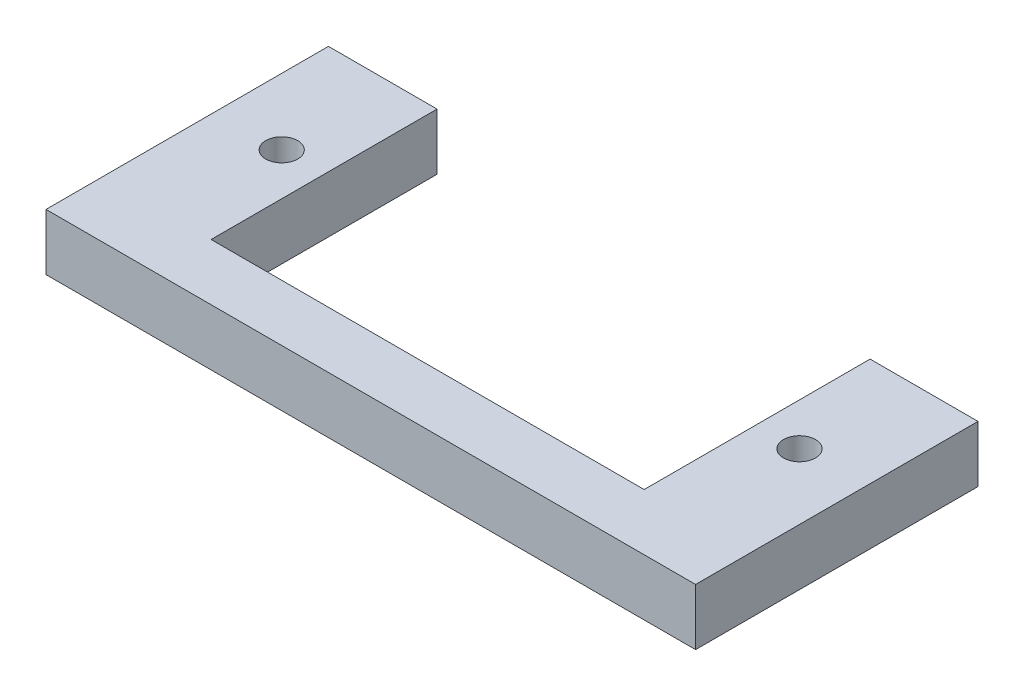
ISO-10303-21;
HEADER;
FILE_DESCRIPTION(('STEP AP214'),'2;1');
FILE_NAME('part.step','',(''),(''),'','','');
FILE_SCHEMA(('AUTOMOTIVE_DESIGN { 1 0 10303 214 1 1 1 1 }'));
ENDSEC;
DATA;
#1=APPLICATION_CONTEXT('core data for automotive mechanical design processes');
#2=APPLICATION_PROTOCOL_DEFINITION('international standard','automotive_design',2000,#1);
#3=PRODUCT_CONTEXT('',#1,'mechanical');
#4=PRODUCT('Part','Part','',(#3));
#5=PRODUCT_RELATED_PRODUCT_CATEGORY('part','',(#4));
#6=PRODUCT_DEFINITION_FORMATION('','',#4);
#7=PRODUCT_DEFINITION_CONTEXT('part definition',#1,'design');
#8=PRODUCT_DEFINITION('design','',#6,#7);
#9=PRODUCT_DEFINITION_SHAPE('','',#8);
#10=(LENGTH_UNIT() NAMED_UNIT(*) SI_UNIT(.MILLI.,.METRE.));
#11=(NAMED_UNIT(*) PLANE_ANGLE_UNIT() SI_UNIT($,.RADIAN.));
#12=(NAMED_UNIT(*) SI_UNIT($,.STERADIAN.) SOLID_ANGLE_UNIT());
#13=UNCERTAINTY_MEASURE_WITH_UNIT(LENGTH_MEASURE(1.E-05),#10,'distance_accuracy_value','');
#14=(GEOMETRIC_REPRESENTATION_CONTEXT(3) GLOBAL_UNCERTAINTY_ASSIGNED_CONTEXT((#13)) GLOBAL_UNIT_ASSIGNED_CONTEXT((#10,
#11,#12)) REPRESENTATION_CONTEXT('',''));
#15=CARTESIAN_POINT('',(0.,0.,0.));
#16=DIRECTION('',(0.,0.,1.));
#17=DIRECTION('',(1.,0.,0.));
#18=AXIS2_PLACEMENT_3D('',#15,#16,#17);
#19=CARTESIAN_POINT('',(0.,3.,0.));
#20=DIRECTION('',(0.,1.,0.));
#21=DIRECTION('',(0.,0.,1.));
#22=AXIS2_PLACEMENT_3D('',#19,#20,#21);
#23=PLANE('',#22);
#24=CARTESIAN_POINT('',(-42.821981333648,3.,-9.));
#25=DIRECTION('',(0.,1.,0.));
#26=DIRECTION('',(0.,0.,1.));
#27=AXIS2_PLACEMENT_3D('',#24,#25,#26);
#28=CIRCLE('',#27,0.85);
#29=CARTESIAN_POINT('',(-42.821981333648,3.,-8.15));
#30=VERTEX_POINT('',#29);
#31=EDGE_CURVE('E142',#30,#30,#28,.T.);
#32=ORIENTED_EDGE('',*,*,#31,.F.);
#33=EDGE_LOOP('',(#32));
#34=FACE_BOUND('',#33,.T.);
#35=DIRECTION('',(-1.,0.,0.));
#36=VECTOR('',#35,1.);
#37=CARTESIAN_POINT('',(-40.571981333648,3.,-15.));
#38=LINE('',#37,#36);
#39=CARTESIAN_POINT('',(-40.571981333648,3.,-15.));
#40=VERTEX_POINT('',#39);
#41=CARTESIAN_POINT('',(-46.3412191443025,3.,-15.));
#42=VERTEX_POINT('',#41);
#43=EDGE_CURVE('E153',#40,#42,#38,.T.);
#44=ORIENTED_EDGE('',*,*,#43,.T.);
#45=DIRECTION('',(0.,0.,1.));
#46=VECTOR('',#45,1.);
#47=CARTESIAN_POINT('',(-46.3412191443025,3.,-15.));
#48=LINE('',#47,#46);
#49=CARTESIAN_POINT('',(-46.3412191443025,3.,0.));
#50=VERTEX_POINT('',#49);
#51=EDGE_CURVE('E101',#42,#50,#48,.T.);
#52=ORIENTED_EDGE('',*,*,#51,.T.);
#53=DIRECTION('',(1.,0.,0.));
#54=VECTOR('',#53,1.);
#55=CARTESIAN_POINT('',(-46.3412191443025,3.,0.));
#56=LINE('',#55,#54);
#57=CARTESIAN_POINT('',(-11.8412191443025,3.,0.));
#58=VERTEX_POINT('',#57);
#59=EDGE_CURVE('E169',#50,#58,#56,.T.);
#60=ORIENTED_EDGE('',*,*,#59,.T.);
#61=DIRECTION('',(0.,0.,-1.));
#62=VECTOR('',#61,1.);
#63=CARTESIAN_POINT('',(-11.8412191443025,3.,0.));
#64=LINE('',#63,#62);
#65=CARTESIAN_POINT('',(-11.8412191443025,3.,-15.));
#66=VERTEX_POINT('',#65);
#67=EDGE_CURVE('E182',#58,#66,#64,.T.);
#68=ORIENTED_EDGE('',*,*,#67,.T.);
#69=DIRECTION('',(-1.,0.,0.));
#70=VECTOR('',#69,1.);
#71=CARTESIAN_POINT('',(-11.8412191443025,3.,-15.));
#72=LINE('',#71,#70);
#73=CARTESIAN_POINT('',(-17.571981333648,3.,-15.));
#74=VERTEX_POINT('',#73);
#75=EDGE_CURVE('E119',#66,#74,#72,.T.);
#76=ORIENTED_EDGE('',*,*,#75,.T.);
#77=DIRECTION('',(0.,0.,1.));
#78=VECTOR('',#77,1.);
#79=CARTESIAN_POINT('',(-17.571981333648,3.,-15.));
#80=LINE('',#79,#78);
#81=CARTESIAN_POINT('',(-17.571981333648,3.,-3.));
#82=VERTEX_POINT('',#81);
#83=EDGE_CURVE('E111',#74,#82,#80,.T.);
#84=ORIENTED_EDGE('',*,*,#83,.T.);
#85=DIRECTION('',(-1.,0.,0.));
#86=VECTOR('',#85,1.);
#87=CARTESIAN_POINT('',(-17.571981333648,3.,-3.));
#88=LINE('',#87,#86);
#89=CARTESIAN_POINT('',(-40.571981333648,3.,-3.));
#90=VERTEX_POINT('',#89);
#91=EDGE_CURVE('E117',#82,#90,#88,.T.);
#92=ORIENTED_EDGE('',*,*,#91,.T.);
#93=DIRECTION('',(0.,0.,-1.));
#94=VECTOR('',#93,1.);
#95=CARTESIAN_POINT('',(-40.571981333648,3.,-3.));
#96=LINE('',#95,#94);
#97=EDGE_CURVE('E59',#90,#40,#96,.T.);
#98=ORIENTED_EDGE('',*,*,#97,.T.);
#99=EDGE_LOOP('',(#44,#52,#60,#68,#76,#84,#92,#98));
#100=FACE_BOUND('',#99,.T.);
#101=CARTESIAN_POINT('',(-15.321981333648,3.,-9.));
#102=DIRECTION('',(0.,1.,0.));
#103=DIRECTION('',(0.,0.,-1.));
#104=AXIS2_PLACEMENT_3D('',#101,#102,#103);
#105=CIRCLE('',#104,0.85);
#106=CARTESIAN_POINT('',(-15.321981333648,3.,-9.85));
#107=VERTEX_POINT('',#106);
#108=EDGE_CURVE('E189',#107,#107,#105,.T.);
#109=ORIENTED_EDGE('',*,*,#108,.F.);
#110=EDGE_LOOP('',(#109));
#111=FACE_BOUND('',#110,.T.);
#112=ADVANCED_FACE('F41',(#34,#100,#111),#23,.T.);
#113=CARTESIAN_POINT('',(0.,0.,0.));
#114=DIRECTION('',(0.,1.,0.));
#115=DIRECTION('',(0.,0.,1.));
#116=AXIS2_PLACEMENT_3D('',#113,#114,#115);
#117=PLANE('',#116);
#118=DIRECTION('',(-1.,0.,0.));
#119=VECTOR('',#118,1.);
#120=CARTESIAN_POINT('',(-40.571981333648,0.,-15.));
#121=LINE('',#120,#119);
#122=CARTESIAN_POINT('',(-40.571981333648,0.,-15.));
#123=VERTEX_POINT('',#122);
#124=CARTESIAN_POINT('',(-46.3412191443025,0.,-15.));
#125=VERTEX_POINT('',#124);
#126=EDGE_CURVE('E140',#123,#125,#121,.T.);
#127=ORIENTED_EDGE('',*,*,#126,.F.);
#128=DIRECTION('',(0.,0.,-1.));
#129=VECTOR('',#128,1.);
#130=CARTESIAN_POINT('',(-40.571981333648,0.,-3.));
#131=LINE('',#130,#129);
#132=CARTESIAN_POINT('',(-40.571981333648,0.,-3.));
#133=VERTEX_POINT('',#132);
#134=EDGE_CURVE('E91',#133,#123,#131,.T.);
#135=ORIENTED_EDGE('',*,*,#134,.F.);
#136=DIRECTION('',(-1.,0.,0.));
#137=VECTOR('',#136,1.);
#138=CARTESIAN_POINT('',(-17.571981333648,0.,-3.));
#139=LINE('',#138,#137);
#140=CARTESIAN_POINT('',(-17.571981333648,0.,-3.));
#141=VERTEX_POINT('',#140);
#142=EDGE_CURVE('E87',#141,#133,#139,.T.);
#143=ORIENTED_EDGE('',*,*,#142,.F.);
#144=DIRECTION('',(0.,0.,1.));
#145=VECTOR('',#144,1.);
#146=CARTESIAN_POINT('',(-17.571981333648,0.,-15.));
#147=LINE('',#146,#145);
#148=CARTESIAN_POINT('',(-17.571981333648,0.,-15.));
#149=VERTEX_POINT('',#148);
#150=EDGE_CURVE('E126',#149,#141,#147,.T.);
#151=ORIENTED_EDGE('',*,*,#150,.F.);
#152=DIRECTION('',(-1.,0.,0.));
#153=VECTOR('',#152,1.);
#154=CARTESIAN_POINT('',(-11.8412191443025,0.,-15.));
#155=LINE('',#154,#153);
#156=CARTESIAN_POINT('',(-11.8412191443025,0.,-15.));
#157=VERTEX_POINT('',#156);
#158=EDGE_CURVE('E146',#157,#149,#155,.T.);
#159=ORIENTED_EDGE('',*,*,#158,.F.);
#160=DIRECTION('',(0.,0.,-1.));
#161=VECTOR('',#160,1.);
#162=CARTESIAN_POINT('',(-11.8412191443025,0.,0.));
#163=LINE('',#162,#161);
#164=CARTESIAN_POINT('',(-11.8412191443025,0.,0.));
#165=VERTEX_POINT('',#164);
#166=EDGE_CURVE('E148',#165,#157,#163,.T.);
#167=ORIENTED_EDGE('',*,*,#166,.F.);
#168=DIRECTION('',(1.,0.,0.));
#169=VECTOR('',#168,1.);
#170=CARTESIAN_POINT('',(-46.3412191443025,0.,0.));
#171=LINE('',#170,#169);
#172=CARTESIAN_POINT('',(-46.3412191443025,0.,0.));
#173=VERTEX_POINT('',#172);
#174=EDGE_CURVE('E145',#173,#165,#171,.T.);
#175=ORIENTED_EDGE('',*,*,#174,.F.);
#176=DIRECTION('',(0.,0.,1.));
#177=VECTOR('',#176,1.);
#178=CARTESIAN_POINT('',(-46.3412191443025,0.,-15.));
#179=LINE('',#178,#177);
#180=EDGE_CURVE('E143',#125,#173,#179,.T.);
#181=ORIENTED_EDGE('',*,*,#180,.F.);
#182=EDGE_LOOP('',(#127,#135,#143,#151,#159,#167,#175,#181));
#183=FACE_BOUND('',#182,.T.);
#184=CARTESIAN_POINT('',(-42.821981333648,0.,-9.));
#185=DIRECTION('',(0.,1.,0.));
#186=DIRECTION('',(0.,0.,1.));
#187=AXIS2_PLACEMENT_3D('',#184,#185,#186);
#188=CIRCLE('',#187,0.85);
#189=CARTESIAN_POINT('',(-42.821981333648,0.,-8.15));
#190=VERTEX_POINT('',#189);
#191=EDGE_CURVE('E190',#190,#190,#188,.T.);
#192=ORIENTED_EDGE('',*,*,#191,.T.);
#193=EDGE_LOOP('',(#192));
#194=FACE_BOUND('',#193,.T.);
#195=CARTESIAN_POINT('',(-15.321981333648,0.,-9.));
#196=DIRECTION('',(0.,1.,0.));
#197=DIRECTION('',(0.,0.,-1.));
#198=AXIS2_PLACEMENT_3D('',#195,#196,#197);
#199=CIRCLE('',#198,0.85);
#200=CARTESIAN_POINT('',(-15.321981333648,0.,-9.85));
#201=VERTEX_POINT('',#200);
#202=EDGE_CURVE('E195',#201,#201,#199,.T.);
#203=ORIENTED_EDGE('',*,*,#202,.T.);
#204=EDGE_LOOP('',(#203));
#205=FACE_BOUND('',#204,.T.);
#206=ADVANCED_FACE('F175',(#183,#194,#205),#117,.F.);
#207=CARTESIAN_POINT('',(-40.571981333648,3.,-15.));
#208=DIRECTION('',(0.,0.,1.));
#209=DIRECTION('',(1.,0.,0.));
#210=AXIS2_PLACEMENT_3D('',#207,#208,#209);
#211=PLANE('',#210);
#212=ORIENTED_EDGE('',*,*,#126,.T.);
#213=DIRECTION('',(0.,-1.,0.));
#214=VECTOR('',#213,1.);
#215=CARTESIAN_POINT('',(-46.3412191443025,3.,-15.));
#216=LINE('',#215,#214);
#217=EDGE_CURVE('E11',#42,#125,#216,.T.);
#218=ORIENTED_EDGE('',*,*,#217,.F.);
#219=ORIENTED_EDGE('',*,*,#43,.F.);
#220=DIRECTION('',(0.,-1.,0.));
#221=VECTOR('',#220,1.);
#222=CARTESIAN_POINT('',(-40.571981333648,3.,-15.));
#223=LINE('',#222,#221);
#224=EDGE_CURVE('E133',#40,#123,#223,.T.);
#225=ORIENTED_EDGE('',*,*,#224,.T.);
#226=EDGE_LOOP('',(#212,#218,#219,#225));
#227=FACE_BOUND('',#226,.T.);
#228=ADVANCED_FACE('F43',(#227),#211,.F.);
#229=CARTESIAN_POINT('',(-46.3412191443025,3.,-15.));
#230=DIRECTION('',(1.,0.,0.));
#231=DIRECTION('',(0.,0.,-1.));
#232=AXIS2_PLACEMENT_3D('',#229,#230,#231);
#233=PLANE('',#232);
#234=ORIENTED_EDGE('',*,*,#180,.T.);
#235=DIRECTION('',(0.,-1.,0.));
#236=VECTOR('',#235,1.);
#237=CARTESIAN_POINT('',(-46.3412191443025,3.,0.));
#238=LINE('',#237,#236);
#239=EDGE_CURVE('E49',#50,#173,#238,.T.);
#240=ORIENTED_EDGE('',*,*,#239,.F.);
#241=ORIENTED_EDGE('',*,*,#51,.F.);
#242=ORIENTED_EDGE('',*,*,#217,.T.);
#243=EDGE_LOOP('',(#234,#240,#241,#242));
#244=FACE_BOUND('',#243,.T.);
#245=ADVANCED_FACE('F223',(#244),#233,.F.);
#246=CARTESIAN_POINT('',(-46.3412191443025,3.,0.));
#247=DIRECTION('',(0.,0.,-1.));
#248=DIRECTION('',(-1.,0.,0.));
#249=AXIS2_PLACEMENT_3D('',#246,#247,#248);
#250=PLANE('',#249);
#251=ORIENTED_EDGE('',*,*,#174,.T.);
#252=DIRECTION('',(0.,-1.,0.));
#253=VECTOR('',#252,1.);
#254=CARTESIAN_POINT('',(-11.8412191443025,3.,0.));
#255=LINE('',#254,#253);
#256=EDGE_CURVE('E159',#58,#165,#255,.T.);
#257=ORIENTED_EDGE('',*,*,#256,.F.);
#258=ORIENTED_EDGE('',*,*,#59,.F.);
#259=ORIENTED_EDGE('',*,*,#239,.T.);
#260=EDGE_LOOP('',(#251,#257,#258,#259));
#261=FACE_BOUND('',#260,.T.);
#262=ADVANCED_FACE('F167',(#261),#250,.F.);
#263=CARTESIAN_POINT('',(-11.8412191443025,3.,0.));
#264=DIRECTION('',(-1.,0.,0.));
#265=DIRECTION('',(0.,0.,1.));
#266=AXIS2_PLACEMENT_3D('',#263,#264,#265);
#267=PLANE('',#266);
#268=ORIENTED_EDGE('',*,*,#166,.T.);
#269=DIRECTION('',(0.,-1.,0.));
#270=VECTOR('',#269,1.);
#271=CARTESIAN_POINT('',(-11.8412191443025,3.,-15.));
#272=LINE('',#271,#270);
#273=EDGE_CURVE('E160',#66,#157,#272,.T.);
#274=ORIENTED_EDGE('',*,*,#273,.F.);
#275=ORIENTED_EDGE('',*,*,#67,.F.);
#276=ORIENTED_EDGE('',*,*,#256,.T.);
#277=EDGE_LOOP('',(#268,#274,#275,#276));
#278=FACE_BOUND('',#277,.T.);
#279=ADVANCED_FACE('F179',(#278),#267,.F.);
#280=CARTESIAN_POINT('',(-11.8412191443025,3.,-15.));
#281=DIRECTION('',(0.,0.,1.));
#282=DIRECTION('',(1.,0.,0.));
#283=AXIS2_PLACEMENT_3D('',#280,#281,#282);
#284=PLANE('',#283);
#285=ORIENTED_EDGE('',*,*,#158,.T.);
#286=DIRECTION('',(0.,-1.,0.));
#287=VECTOR('',#286,1.);
#288=CARTESIAN_POINT('',(-17.571981333648,3.,-15.));
#289=LINE('',#288,#287);
#290=EDGE_CURVE('E129',#74,#149,#289,.T.);
#291=ORIENTED_EDGE('',*,*,#290,.F.);
#292=ORIENTED_EDGE('',*,*,#75,.F.);
#293=ORIENTED_EDGE('',*,*,#273,.T.);
#294=EDGE_LOOP('',(#285,#291,#292,#293));
#295=FACE_BOUND('',#294,.T.);
#296=ADVANCED_FACE('F178',(#295),#284,.F.);
#297=CARTESIAN_POINT('',(-17.571981333648,3.,-15.));
#298=DIRECTION('',(1.,0.,0.));
#299=DIRECTION('',(0.,0.,-1.));
#300=AXIS2_PLACEMENT_3D('',#297,#298,#299);
#301=PLANE('',#300);
#302=ORIENTED_EDGE('',*,*,#150,.T.);
#303=DIRECTION('',(0.,-1.,0.));
#304=VECTOR('',#303,1.);
#305=CARTESIAN_POINT('',(-17.571981333648,3.,-3.));
#306=LINE('',#305,#304);
#307=EDGE_CURVE('E123',#82,#141,#306,.T.);
#308=ORIENTED_EDGE('',*,*,#307,.F.);
#309=ORIENTED_EDGE('',*,*,#83,.F.);
#310=ORIENTED_EDGE('',*,*,#290,.T.);
#311=EDGE_LOOP('',(#302,#308,#309,#310));
#312=FACE_BOUND('',#311,.T.);
#313=ADVANCED_FACE('F127',(#312),#301,.F.);
#314=CARTESIAN_POINT('',(-17.571981333648,3.,-3.));
#315=DIRECTION('',(0.,0.,1.));
#316=DIRECTION('',(1.,0.,0.));
#317=AXIS2_PLACEMENT_3D('',#314,#315,#316);
#318=PLANE('',#317);
#319=ORIENTED_EDGE('',*,*,#142,.T.);
#320=DIRECTION('',(0.,-1.,0.));
#321=VECTOR('',#320,1.);
#322=CARTESIAN_POINT('',(-40.571981333648,3.,-3.));
#323=LINE('',#322,#321);
#324=EDGE_CURVE('E128',#90,#133,#323,.T.);
#325=ORIENTED_EDGE('',*,*,#324,.F.);
#326=ORIENTED_EDGE('',*,*,#91,.F.);
#327=ORIENTED_EDGE('',*,*,#307,.T.);
#328=EDGE_LOOP('',(#319,#325,#326,#327));
#329=FACE_BOUND('',#328,.T.);
#330=ADVANCED_FACE('F135',(#329),#318,.F.);
#331=CARTESIAN_POINT('',(-40.571981333648,3.,-3.));
#332=DIRECTION('',(-1.,0.,0.));
#333=DIRECTION('',(0.,0.,1.));
#334=AXIS2_PLACEMENT_3D('',#331,#332,#333);
#335=PLANE('',#334);
#336=ORIENTED_EDGE('',*,*,#134,.T.);
#337=ORIENTED_EDGE('',*,*,#224,.F.);
#338=ORIENTED_EDGE('',*,*,#97,.F.);
#339=ORIENTED_EDGE('',*,*,#324,.T.);
#340=EDGE_LOOP('',(#336,#337,#338,#339));
#341=FACE_BOUND('',#340,.T.);
#342=ADVANCED_FACE('F213',(#341),#335,.F.);
#343=CARTESIAN_POINT('',(-42.821981333648,3.,-9.));
#344=DIRECTION('',(0.,-1.,0.));
#345=DIRECTION('',(0.,0.,-1.));
#346=AXIS2_PLACEMENT_3D('',#343,#344,#345);
#347=CYLINDRICAL_SURFACE('',#346,0.85);
#348=ORIENTED_EDGE('',*,*,#31,.T.);
#349=EDGE_LOOP('',(#348));
#350=FACE_BOUND('',#349,.T.);
#351=ORIENTED_EDGE('',*,*,#191,.F.);
#352=EDGE_LOOP('',(#351));
#353=FACE_BOUND('',#352,.T.);
#354=ADVANCED_FACE('F209',(#350,#353),#347,.F.);
#355=CARTESIAN_POINT('',(-15.321981333648,3.,-9.));
#356=DIRECTION('',(0.,-1.,0.));
#357=DIRECTION('',(0.,0.,-1.));
#358=AXIS2_PLACEMENT_3D('',#355,#356,#357);
#359=CYLINDRICAL_SURFACE('',#358,0.85);
#360=ORIENTED_EDGE('',*,*,#108,.T.);
#361=EDGE_LOOP('',(#360));
#362=FACE_BOUND('',#361,.T.);
#363=ORIENTED_EDGE('',*,*,#202,.F.);
#364=EDGE_LOOP('',(#363));
#365=FACE_BOUND('',#364,.T.);
#366=ADVANCED_FACE('F200',(#362,#365),#359,.F.);
#367=CLOSED_SHELL('',(#112,#206,#228,#245,#262,#279,#296,#313,#330,#342,#354,#366));
#368=MANIFOLD_SOLID_BREP('B2',#367);
#369=ADVANCED_BREP_SHAPE_REPRESENTATION('',(#18,#368),#14);
#370=SHAPE_DEFINITION_REPRESENTATION(#9,#369);
ENDSEC;
END-ISO-10303-21;
